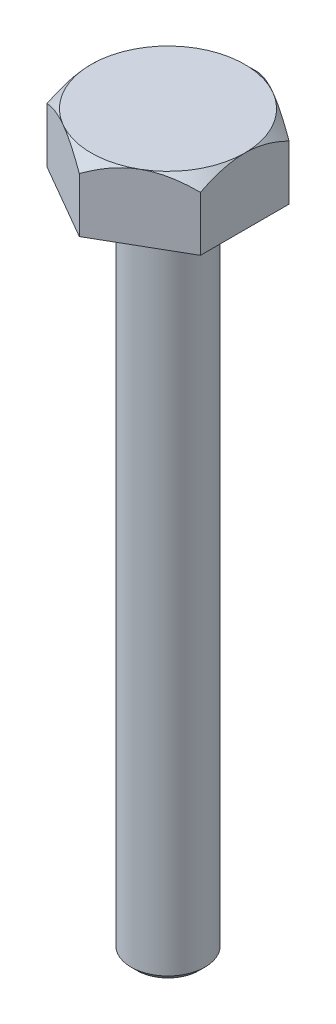
ISO-10303-21;
HEADER;
FILE_DESCRIPTION(('STEP AP214'),'2;1');
FILE_NAME('part.step','',(''),(''),'','','');
FILE_SCHEMA(('AUTOMOTIVE_DESIGN { 1 0 10303 214 1 1 1 1 }'));
ENDSEC;
DATA;
#1=APPLICATION_CONTEXT('core data for automotive mechanical design processes');
#2=APPLICATION_PROTOCOL_DEFINITION('international standard','automotive_design',2000,#1);
#3=PRODUCT_CONTEXT('',#1,'mechanical');
#4=PRODUCT('Part','Part','',(#3));
#5=PRODUCT_RELATED_PRODUCT_CATEGORY('part','',(#4));
#6=PRODUCT_DEFINITION_FORMATION('','',#4);
#7=PRODUCT_DEFINITION_CONTEXT('part definition',#1,'design');
#8=PRODUCT_DEFINITION('design','',#6,#7);
#9=PRODUCT_DEFINITION_SHAPE('','',#8);
#10=(LENGTH_UNIT() NAMED_UNIT(*) SI_UNIT(.MILLI.,.METRE.));
#11=(NAMED_UNIT(*) PLANE_ANGLE_UNIT() SI_UNIT($,.RADIAN.));
#12=(NAMED_UNIT(*) SI_UNIT($,.STERADIAN.) SOLID_ANGLE_UNIT());
#13=UNCERTAINTY_MEASURE_WITH_UNIT(LENGTH_MEASURE(1.E-05),#10,'distance_accuracy_value','');
#14=(GEOMETRIC_REPRESENTATION_CONTEXT(3) GLOBAL_UNCERTAINTY_ASSIGNED_CONTEXT((#13)) GLOBAL_UNIT_ASSIGNED_CONTEXT((#10,
#11,#12)) REPRESENTATION_CONTEXT('',''));
#15=CARTESIAN_POINT('',(0.,0.,0.));
#16=DIRECTION('',(0.,0.,1.));
#17=DIRECTION('',(1.,0.,0.));
#18=AXIS2_PLACEMENT_3D('',#15,#16,#17);
#19=CARTESIAN_POINT('',(0.,11.43,15.2512847109132));
#20=DIRECTION('',(-0.500000000000002,0.,-0.866025403784434));
#21=DIRECTION('',(-0.866025403784439,0.,0.499999999999996));
#22=AXIS2_PLACEMENT_3D('',#19,#20,#21);
#23=PLANE('',#22);
#24=CARTESIAN_POINT('',(-0.000199999999977996,9.38659981772166,15.251400180967));
#25=CARTESIAN_POINT('',(0.226873889695165,9.51768133076551,15.1202990096256));
#26=CARTESIAN_POINT('',(0.455726124637406,9.64476291818929,14.9881711101771));
#27=CARTESIAN_POINT('',(0.917264089385894,9.88965567416285,14.7217020419883));
#28=CARTESIAN_POINT('',(1.14995183005661,10.0074617799246,14.5873597122749));
#29=CARTESIAN_POINT('',(1.620535086189,10.2330319018744,14.3156683426708));
#30=CARTESIAN_POINT('',(1.85845279116084,10.3407345592772,14.1783064916603));
#31=CARTESIAN_POINT('',(2.33819586731142,10.5437586121221,13.9013266975029));
#32=CARTESIAN_POINT('',(2.58002063469585,10.639081900468,13.7617091029568));
#33=CARTESIAN_POINT('',(3.06368975918541,10.8143312174838,13.482462603734));
#34=CARTESIAN_POINT('',(3.30547468115945,10.8944747031529,13.3428680139463));
#35=CARTESIAN_POINT('',(3.79243386403268,11.0395670742934,13.0617219986301));
#36=CARTESIAN_POINT('',(4.03760775703844,11.1045175955454,12.9201707855049));
#37=CARTESIAN_POINT('',(4.53029621798643,11.2175888662254,12.63571696995));
#38=CARTESIAN_POINT('',(4.77780420672642,11.2657474965849,12.4928181660244));
#39=CARTESIAN_POINT('',(5.274898043017,11.3441767790177,12.2058209058295));
#40=CARTESIAN_POINT('',(5.52448357442961,11.3744501039869,12.0617226320825));
#41=CARTESIAN_POINT('',(6.13270550591775,11.4252101217525,11.7105655362108));
#42=CARTESIAN_POINT('',(6.49199931490381,11.4358618520917,11.5031271588746));
#43=CARTESIAN_POINT('',(7.20993709156137,11.4179816604071,11.08862559026));
#44=CARTESIAN_POINT('',(7.56858078733386,11.3894360036266,10.8815625559626));
#45=CARTESIAN_POINT('',(8.28248737985596,11.2948459617686,10.4693883925937));
#46=CARTESIAN_POINT('',(8.63774604391107,11.2287596468772,10.2642797072695));
#47=CARTESIAN_POINT('',(9.34215714214685,11.0626805202821,9.85758777008291));
#48=CARTESIAN_POINT('',(9.6913100424312,10.9626903087312,9.6560042491154));
#49=CARTESIAN_POINT('',(10.3110962937451,10.75698777407,9.29817049007927));
#50=CARTESIAN_POINT('',(10.5831024755108,10.6566870014691,9.1411276478156));
#51=CARTESIAN_POINT('',(11.1222324057565,10.4399235544401,8.82986083746005));
#52=CARTESIAN_POINT('',(11.3893560063565,10.3234603914122,8.67563695474674));
#53=CARTESIAN_POINT('',(11.9178793964651,10.0769825256759,8.37049383319454));
#54=CARTESIAN_POINT('',(12.1792942169843,9.9470104418666,8.21956591619763));
#55=CARTESIAN_POINT('',(12.6972836049224,9.67522082426369,7.92050460363419));
#56=CARTESIAN_POINT('',(12.9538610230554,9.53341055243061,7.77236956220708));
#57=CARTESIAN_POINT('',(13.2082,9.38659981772166,7.62552688540263));
#58=B_SPLINE_CURVE_WITH_KNOTS('',3,(#24,#25,#26,#27,#28,#29,#30,#31,#32,#33,#34,#35,#36,#37,#38,
#39,#40,#41,#42,#43,#44,#45,#46,#47,#48,#49,#50,#51,#52,#53,#54,#55,#56,#57),.UNSPECIFIED.,.F.,
.F.,(4,2,2,2,2,2,2,2,2,2,2,2,2,2,2,2,4),(0.,0.879464255051313,1.7594052628329,2.64438444686978,
3.5292281508387,4.40023568945079,5.27114940610042,6.14008551481257,7.00889173121453,
8.25199168167069,9.49552732527543,10.7404546341098,11.9852864887421,12.9739587551436,
13.9626609162771,14.9483334434941,15.9334057062132),.UNSPECIFIED.);
#59=CARTESIAN_POINT('',(0.,9.38671528908685,15.2512847109131));
#60=VERTEX_POINT('',#59);
#61=CARTESIAN_POINT('',(6.60400000000003,11.43,11.4384635331848));
#62=VERTEX_POINT('',#61);
#63=EDGE_CURVE('E186',#60,#62,#58,.T.);
#64=ORIENTED_EDGE('',*,*,#63,.F.);
#65=DIRECTION('',(0.,-0.999999999999995,0.));
#66=VECTOR('',#65,1.);
#67=CARTESIAN_POINT('',(0.,11.43,15.2512847109132));
#68=LINE('',#67,#66);
#69=CARTESIAN_POINT('',(0.,0.,15.2512847109132));
#70=VERTEX_POINT('',#69);
#71=EDGE_CURVE('E189',#60,#70,#68,.T.);
#72=ORIENTED_EDGE('',*,*,#71,.T.);
#73=DIRECTION('',(0.866025403784439,0.,-0.499999999999996));
#74=VECTOR('',#73,1.);
#75=CARTESIAN_POINT('',(0.,0.,15.2512847109132));
#76=LINE('',#75,#74);
#77=CARTESIAN_POINT('',(13.208,0.,7.6256423554566));
#78=VERTEX_POINT('',#77);
#79=EDGE_CURVE('E192',#70,#78,#76,.T.);
#80=ORIENTED_EDGE('',*,*,#79,.T.);
#81=DIRECTION('',(0.,-0.999999999999995,0.));
#82=VECTOR('',#81,1.);
#83=CARTESIAN_POINT('',(13.208,11.43,7.6256423554566));
#84=LINE('',#83,#82);
#85=CARTESIAN_POINT('',(13.208,9.38671528908685,7.6256423554566));
#86=VERTEX_POINT('',#85);
#87=EDGE_CURVE('E212',#86,#78,#84,.T.);
#88=ORIENTED_EDGE('',*,*,#87,.F.);
#89=EDGE_CURVE('E128',#62,#86,#58,.T.);
#90=ORIENTED_EDGE('',*,*,#89,.F.);
#91=EDGE_LOOP('',(#64,#72,#80,#88,#90));
#92=FACE_BOUND('',#91,.T.);
#93=ADVANCED_FACE('F53',(#92),#23,.F.);
#94=CARTESIAN_POINT('',(13.208,11.43,7.6256423554566));
#95=DIRECTION('',(-1.,0.,0.));
#96=DIRECTION('',(0.,0.,0.999999999999994));
#97=AXIS2_PLACEMENT_3D('',#94,#95,#96);
#98=PLANE('',#97);
#99=CARTESIAN_POINT('',(13.2080000000001,2.76967233523581,-17.429070280812));
#100=CARTESIAN_POINT('',(13.208,2.9353970235161,-17.2211314528595));
#101=CARTESIAN_POINT('',(13.208,3.10046346010986,-17.0126683334499));
#102=CARTESIAN_POINT('',(13.208,3.42914989687208,-16.594600449289));
#103=CARTESIAN_POINT('',(13.208,3.59276987696749,-16.3849956687595));
#104=CARTESIAN_POINT('',(13.208,4.0813224062418,-15.7542552195547));
#105=CARTESIAN_POINT('',(13.208,4.40388225777537,-15.3312751583127));
#106=CARTESIAN_POINT('',(13.208,5.04374780573923,-14.4763413305069));
#107=CARTESIAN_POINT('',(13.208,5.36099524275694,-14.0443438715202));
#108=CARTESIAN_POINT('',(13.208,5.98591190678579,-13.1735000637183));
#109=CARTESIAN_POINT('',(13.208,6.29358176929005,-12.7346541722248));
#110=CARTESIAN_POINT('',(13.208,6.92037320672384,-11.8146163167322));
#111=CARTESIAN_POINT('',(13.208,7.2385425352617,-11.3327725601302));
#112=CARTESIAN_POINT('',(13.208,7.85730475788191,-10.3577272750961));
#113=CARTESIAN_POINT('',(13.208,8.15789434448009,-9.86452363356868));
#114=CARTESIAN_POINT('',(13.208,8.73527228901875,-8.86627565247157));
#115=CARTESIAN_POINT('',(13.208,9.01212968907671,-8.36127150526345));
#116=CARTESIAN_POINT('',(13.208,9.53587440828102,-7.3360109441263));
#117=CARTESIAN_POINT('',(13.208,9.78277693834321,-6.81576243924099));
#118=CARTESIAN_POINT('',(13.208,10.1087397522399,-6.0573120283966));
#119=CARTESIAN_POINT('',(13.208,10.2037703363853,-5.8259487063906));
#120=CARTESIAN_POINT('',(13.208,10.3854713165141,-5.35998212042249));
#121=CARTESIAN_POINT('',(13.208,10.4721418936652,-5.12537892679686));
#122=CARTESIAN_POINT('',(13.208,10.7181863380057,-4.41656640225382));
#123=CARTESIAN_POINT('',(13.208,10.863611701905,-3.93731127460361));
#124=CARTESIAN_POINT('',(13.208,11.0462428459499,-3.21517741083885));
#125=CARTESIAN_POINT('',(13.208,11.1007849663038,-2.97659274330587));
#126=CARTESIAN_POINT('',(13.208,11.198080943139,-2.49704478186697));
#127=CARTESIAN_POINT('',(13.208,11.2408368877663,-2.2560819171499));
#128=CARTESIAN_POINT('',(13.208,11.3137704442067,-1.77228873749174));
#129=CARTESIAN_POINT('',(13.208,11.3439497966817,-1.52945868571975));
#130=CARTESIAN_POINT('',(13.208,11.3911362012472,-1.04251722126132));
#131=CARTESIAN_POINT('',(13.208,11.4081435620685,-0.798405838742286));
#132=CARTESIAN_POINT('',(13.208,11.4279880826698,-0.324899388387731));
#133=CARTESIAN_POINT('',(13.208,11.4316447102923,-0.0955384590511861));
#134=CARTESIAN_POINT('',(13.208,11.4270007132432,0.36305821272874));
#135=CARTESIAN_POINT('',(13.208,11.4187002948486,0.5922939572635));
#136=CARTESIAN_POINT('',(13.208,11.3902960558949,1.05002944978805));
#137=CARTESIAN_POINT('',(13.208,11.3701924019101,1.27852920811875));
#138=CARTESIAN_POINT('',(13.208,11.3185575189658,1.7342453917134));
#139=CARTESIAN_POINT('',(13.208,11.2870246224803,1.96146162479572));
#140=CARTESIAN_POINT('',(13.208,11.1746214023067,2.64916603023997));
#141=CARTESIAN_POINT('',(13.208,11.0765177927118,3.10691808382931));
#142=CARTESIAN_POINT('',(13.208,10.8410622083311,4.01193638688664));
#143=CARTESIAN_POINT('',(13.208,10.7037100097382,4.45920257654539));
#144=CARTESIAN_POINT('',(13.208,10.396494288822,5.34234869988729));
#145=CARTESIAN_POINT('',(13.208,10.2266271002391,5.77822734325166));
#146=CARTESIAN_POINT('',(13.208,9.86052168821442,6.63885682171184));
#147=CARTESIAN_POINT('',(13.208,9.66427212593931,7.06360277779132));
#148=CARTESIAN_POINT('',(13.208,9.25005326483396,7.90390303770095));
#149=CARTESIAN_POINT('',(13.208,9.03201917186019,8.31942514056893));
#150=CARTESIAN_POINT('',(13.208,8.57900114531303,9.14098385594647));
#151=CARTESIAN_POINT('',(13.208,8.34401971279601,9.5470218564407));
#152=CARTESIAN_POINT('',(13.208,7.87234617095731,10.330971193627));
#153=CARTESIAN_POINT('',(13.208,7.63631257225012,10.7092808372323));
#154=CARTESIAN_POINT('',(13.208,7.15410414783115,11.459399731739));
#155=CARTESIAN_POINT('',(13.208,6.90792857699179,11.8312085021544));
#156=CARTESIAN_POINT('',(13.208,6.40920790622932,12.5662260323197));
#157=CARTESIAN_POINT('',(13.208,6.15672850713001,12.9294795322765));
#158=CARTESIAN_POINT('',(13.208,5.64492806404401,13.6509899876102));
#159=CARTESIAN_POINT('',(13.208,5.38560892111492,14.0092482899173));
#160=CARTESIAN_POINT('',(13.208,5.12348725560632,14.3654078832139));
#161=B_SPLINE_CURVE_WITH_KNOTS('',3,(#99,#100,#101,#102,#103,#104,#105,#106,#107,#108,#109,#110,
#111,#112,#113,#114,#115,#116,#117,#118,#119,#120,#121,#122,#123,#124,#125,#126,#127,#128,#129,
#130,#131,#132,#133,#134,#135,#136,#137,#138,#139,#140,#141,#142,#143,#144,#145,#146,#147,#148,
#149,#150,#151,#152,#153,#154,#155,#156,#157,#158,#159,#160),.UNSPECIFIED.,.F.,.F.,(4,2,2,2,2,2,
2,2,2,2,2,2,2,2,2,2,2,2,2,2,2,2,2,2,2,2,2,2,2,2,4),(0.,0.797699900199711,1.59541085307429,
3.19114650853791,4.79896207154998,6.40667072408131,8.13861282556662,9.87087973637845,
11.5979227721281,13.3240851215051,14.074296886582,14.8244923903456,16.3247433531157,
17.0587283844279,17.7925832925867,18.5263365978717,19.2600727046128,19.9479341433099,
20.6357837154971,21.3236235805764,22.0115638418952,23.4137580889485,24.8159603318869,
26.2183207747508,27.6212858741094,29.0285556270311,30.4356181210347,31.7731399042402,
33.1107601306192,34.4378108460383,35.7644965252694),.UNSPECIFIED.);
#162=CARTESIAN_POINT('',(13.208,11.43,0.));
#163=VERTEX_POINT('',#162);
#164=EDGE_CURVE('E124',#86,#163,#161,.F.);
#165=ORIENTED_EDGE('',*,*,#164,.F.);
#166=ORIENTED_EDGE('',*,*,#87,.T.);
#167=DIRECTION('',(0.,0.,-0.999999999999994));
#168=VECTOR('',#167,1.);
#169=CARTESIAN_POINT('',(13.208,0.,7.6256423554566));
#170=LINE('',#169,#168);
#171=CARTESIAN_POINT('',(13.208,0.,-7.62564235545665));
#172=VERTEX_POINT('',#171);
#173=EDGE_CURVE('E268',#78,#172,#170,.T.);
#174=ORIENTED_EDGE('',*,*,#173,.T.);
#175=DIRECTION('',(0.,-0.999999999999995,0.));
#176=VECTOR('',#175,1.);
#177=CARTESIAN_POINT('',(13.208,11.43,-7.62564235545665));
#178=LINE('',#177,#176);
#179=CARTESIAN_POINT('',(13.208,9.38671528908685,-7.62564235545665));
#180=VERTEX_POINT('',#179);
#181=EDGE_CURVE('E153',#180,#172,#178,.T.);
#182=ORIENTED_EDGE('',*,*,#181,.F.);
#183=EDGE_CURVE('E132',#163,#180,#161,.F.);
#184=ORIENTED_EDGE('',*,*,#183,.F.);
#185=EDGE_LOOP('',(#165,#166,#174,#182,#184));
#186=FACE_BOUND('',#185,.T.);
#187=ADVANCED_FACE('F151',(#186),#98,.F.);
#188=CARTESIAN_POINT('',(13.208,11.43,-7.62564235545665));
#189=DIRECTION('',(-0.5,0.,0.866025403784433));
#190=DIRECTION('',(0.866025403784439,0.,0.5));
#191=AXIS2_PLACEMENT_3D('',#188,#189,#190);
#192=PLANE('',#191);
#193=CARTESIAN_POINT('',(13.2081999999999,9.38659981772166,-7.62552688540274));
#194=CARTESIAN_POINT('',(12.9811261103048,9.51768133076545,-7.75662805674423));
#195=CARTESIAN_POINT('',(12.7522738753626,9.6447629181892,-7.8887559561928));
#196=CARTESIAN_POINT('',(12.2907359106142,9.88965567416273,-8.15522502438158));
#197=CARTESIAN_POINT('',(12.0580481699435,10.0074617799245,-8.28956735409493));
#198=CARTESIAN_POINT('',(11.5874649138111,10.2330319018743,-8.56125872369908));
#199=CARTESIAN_POINT('',(11.3495472088392,10.3407345592771,-8.69862057470955));
#200=CARTESIAN_POINT('',(10.8698041326887,10.543758612122,-8.97560036886695));
#201=CARTESIAN_POINT('',(10.6279793653042,10.6390819004678,-9.11521796341307));
#202=CARTESIAN_POINT('',(10.1443102408147,10.8143312174837,-9.39446446263583));
#203=CARTESIAN_POINT('',(9.90252531884064,10.8944747031527,-9.53405905242353));
#204=CARTESIAN_POINT('',(9.41556613596741,11.0395670742932,-9.81520506773975));
#205=CARTESIAN_POINT('',(9.17039224296165,11.1045175955453,-9.95675628086488));
#206=CARTESIAN_POINT('',(8.67770378201369,11.2175888662252,-10.2412100964198));
#207=CARTESIAN_POINT('',(8.43019579327372,11.2657474965847,-10.3841089003455));
#208=CARTESIAN_POINT('',(7.93310195698311,11.3441767790176,-10.6711061605403));
#209=CARTESIAN_POINT('',(7.68351642557047,11.3744501039869,-10.8152044342871));
#210=CARTESIAN_POINT('',(7.07529449408231,11.4252101217525,-11.1663615301588));
#211=CARTESIAN_POINT('',(6.71600068509632,11.4358618520916,-11.3737999074951));
#212=CARTESIAN_POINT('',(5.99806290843879,11.4179816604069,-11.7883014761099));
#213=CARTESIAN_POINT('',(5.63941921266626,11.3894360036264,-11.9953645104073));
#214=CARTESIAN_POINT('',(4.92551262014413,11.2948459617684,-12.4075386737762));
#215=CARTESIAN_POINT('',(4.57025395608904,11.2287596468769,-12.6126473591003));
#216=CARTESIAN_POINT('',(3.86584285785319,11.0626805202819,-13.0193392962869));
#217=CARTESIAN_POINT('',(3.51668995756876,10.9626903087312,-13.2209228172544));
#218=CARTESIAN_POINT('',(2.89690370625486,10.75698777407,-13.5787565762905));
#219=CARTESIAN_POINT('',(2.62489752448925,10.656687001469,-13.7357994185542));
#220=CARTESIAN_POINT('',(2.08576759424359,10.4399235544399,-14.0470662289098));
#221=CARTESIAN_POINT('',(1.81864399364359,10.323460391412,-14.2012901116231));
#222=CARTESIAN_POINT('',(1.29012060353502,10.0769825256757,-14.5064332331753));
#223=CARTESIAN_POINT('',(1.02870578301584,9.94701044186642,-14.6573611501722));
#224=CARTESIAN_POINT('',(0.51071639507776,9.67522082426353,-14.9564224627356));
#225=CARTESIAN_POINT('',(0.254138976944705,9.5334105524305,-15.1045575041626));
#226=CARTESIAN_POINT('',(-0.000200000000005751,9.38659981772166,-15.251400180967));
#227=B_SPLINE_CURVE_WITH_KNOTS('',3,(#193,#194,#195,#196,#197,#198,#199,#200,#201,#202,#203,
#204,#205,#206,#207,#208,#209,#210,#211,#212,#213,#214,#215,#216,#217,#218,#219,#220,#221,#222,
#223,#224,#225,#226),.UNSPECIFIED.,.F.,.F.,(4,2,2,2,2,2,2,2,2,2,2,2,2,2,2,2,4),(0.,
0.87946425505127,1.75940526283282,2.6443844468697,3.5292281508386,4.40023568945069,
5.2711494061003,6.14008551481242,7.00889173121434,8.25199168167052,9.49552732527531,
10.7404546341097,11.9852864887421,12.9739587551435,13.9626609162769,14.948333443494,
15.9334057062131),.UNSPECIFIED.);
#228=CARTESIAN_POINT('',(6.604,11.43,-11.4384635331849));
#229=VERTEX_POINT('',#228);
#230=EDGE_CURVE('E139',#180,#229,#227,.T.);
#231=ORIENTED_EDGE('',*,*,#230,.F.);
#232=ORIENTED_EDGE('',*,*,#181,.T.);
#233=DIRECTION('',(-0.866025403784439,0.,-0.5));
#234=VECTOR('',#233,1.);
#235=CARTESIAN_POINT('',(13.208,0.,-7.62564235545665));
#236=LINE('',#235,#234);
#237=CARTESIAN_POINT('',(0.,0.,-15.2512847109131));
#238=VERTEX_POINT('',#237);
#239=EDGE_CURVE('E269',#172,#238,#236,.T.);
#240=ORIENTED_EDGE('',*,*,#239,.T.);
#241=DIRECTION('',(0.,-0.999999999999995,0.));
#242=VECTOR('',#241,1.);
#243=CARTESIAN_POINT('',(0.,11.43,-15.2512847109131));
#244=LINE('',#243,#242);
#245=CARTESIAN_POINT('',(0.,9.38671528908685,-15.2512847109131));
#246=VERTEX_POINT('',#245);
#247=EDGE_CURVE('E209',#246,#238,#244,.T.);
#248=ORIENTED_EDGE('',*,*,#247,.F.);
#249=EDGE_CURVE('E154',#229,#246,#227,.T.);
#250=ORIENTED_EDGE('',*,*,#249,.F.);
#251=EDGE_LOOP('',(#231,#232,#240,#248,#250));
#252=FACE_BOUND('',#251,.T.);
#253=ADVANCED_FACE('F177',(#252),#192,.F.);
#254=CARTESIAN_POINT('',(0.,11.43,-15.2512847109131));
#255=DIRECTION('',(0.500000000000002,0.,0.866025403784433));
#256=DIRECTION('',(0.866025403784438,0.,-0.499999999999996));
#257=AXIS2_PLACEMENT_3D('',#254,#255,#256);
#258=PLANE('',#257);
#259=CARTESIAN_POINT('',(0.00019999999995024,9.38659981772166,-15.251400180967));
#260=CARTESIAN_POINT('',(-0.226873889695179,9.51768133076548,-15.1202990096255));
#261=CARTESIAN_POINT('',(-0.455726124637413,9.64476291818924,-14.988171110177));
#262=CARTESIAN_POINT('',(-0.91726408938589,9.8896556741628,-14.7217020419882));
#263=CARTESIAN_POINT('',(-1.1499518300566,10.0074617799245,-14.5873597122749));
#264=CARTESIAN_POINT('',(-1.62053508618899,10.2330319018743,-14.3156683426707));
#265=CARTESIAN_POINT('',(-1.85845279116083,10.3407345592771,-14.1783064916602));
#266=CARTESIAN_POINT('',(-2.3381958673114,10.5437586121221,-13.9013266975028));
#267=CARTESIAN_POINT('',(-2.58002063469583,10.6390819004679,-13.7617091029567));
#268=CARTESIAN_POINT('',(-3.06368975918538,10.8143312174838,-13.4824626037339));
#269=CARTESIAN_POINT('',(-3.30547468115942,10.8944747031528,-13.3428680139462));
#270=CARTESIAN_POINT('',(-3.79243386403265,11.0395670742933,-13.06172199863));
#271=CARTESIAN_POINT('',(-4.03760775703841,11.1045175955454,-12.9201707855049));
#272=CARTESIAN_POINT('',(-4.53029621798639,11.2175888662253,-12.6357169699499));
#273=CARTESIAN_POINT('',(-4.77780420672637,11.2657474965849,-12.4928181660243));
#274=CARTESIAN_POINT('',(-5.27489804301698,11.3441767790177,-12.2058209058294));
#275=CARTESIAN_POINT('',(-5.52448357442963,11.3744501039869,-12.0617226320826));
#276=CARTESIAN_POINT('',(-6.13270550591779,11.4252101217525,-11.7105655362109));
#277=CARTESIAN_POINT('',(-6.49199931490378,11.4358618520917,-11.5031271588746));
#278=CARTESIAN_POINT('',(-7.2099370915613,11.4179816604071,-11.0886255902599));
#279=CARTESIAN_POINT('',(-7.56858078733382,11.3894360036266,-10.8815625559625));
#280=CARTESIAN_POINT('',(-8.28248737985592,11.2948459617685,-10.4693883925936));
#281=CARTESIAN_POINT('',(-8.63774604391102,11.2287596468772,-10.2642797072694));
#282=CARTESIAN_POINT('',(-9.34215714214682,11.0626805202821,-9.85758777008286));
#283=CARTESIAN_POINT('',(-9.6913100424312,10.9626903087312,-9.65600424911541));
#284=CARTESIAN_POINT('',(-10.3110962937451,10.75698777407,-9.29817049007927));
#285=CARTESIAN_POINT('',(-10.5831024755108,10.6566870014691,-9.14112764781556));
#286=CARTESIAN_POINT('',(-11.1222324057565,10.4399235544401,-8.82986083745998));
#287=CARTESIAN_POINT('',(-11.3893560063565,10.3234603914122,-8.67563695474669));
#288=CARTESIAN_POINT('',(-11.917879396465,10.0769825256759,-8.37049383319449));
#289=CARTESIAN_POINT('',(-12.1792942169842,9.9470104418666,-8.21956591619757));
#290=CARTESIAN_POINT('',(-12.6972836049223,9.67522082426369,-7.92050460363417));
#291=CARTESIAN_POINT('',(-12.9538610230553,9.53341055243061,-7.77236956220709));
#292=CARTESIAN_POINT('',(-13.2082,9.38659981772166,-7.62552688540274));
#293=B_SPLINE_CURVE_WITH_KNOTS('',3,(#259,#260,#261,#262,#263,#264,#265,#266,#267,#268,#269,
#270,#271,#272,#273,#274,#275,#276,#277,#278,#279,#280,#281,#282,#283,#284,#285,#286,#287,#288,
#289,#290,#291,#292),.UNSPECIFIED.,.F.,.F.,(4,2,2,2,2,2,2,2,2,2,2,2,2,2,2,2,4),(0.,
0.879464255051304,1.75940526283289,2.64438444686976,3.52922815083867,4.40023568945076,
5.27114940610039,6.14008551481253,7.00889173121449,8.25199168167065,9.49552732527539,
10.7404546341097,11.9852864887421,12.9739587551436,13.962660916277,14.948333443494,
15.9334057062131),.UNSPECIFIED.);
#294=CARTESIAN_POINT('',(-6.60400000000008,11.43,-11.4384635331848));
#295=VERTEX_POINT('',#294);
#296=EDGE_CURVE('E248',#246,#295,#293,.T.);
#297=ORIENTED_EDGE('',*,*,#296,.F.);
#298=ORIENTED_EDGE('',*,*,#247,.T.);
#299=DIRECTION('',(-0.866025403784439,0.,0.499999999999996));
#300=VECTOR('',#299,1.);
#301=CARTESIAN_POINT('',(0.,0.,-15.2512847109131));
#302=LINE('',#301,#300);
#303=CARTESIAN_POINT('',(-13.2080000000001,0.,-7.62564235545665));
#304=VERTEX_POINT('',#303);
#305=EDGE_CURVE('E265',#238,#304,#302,.T.);
#306=ORIENTED_EDGE('',*,*,#305,.T.);
#307=DIRECTION('',(0.,-0.999999999999995,0.));
#308=VECTOR('',#307,1.);
#309=CARTESIAN_POINT('',(-13.2080000000001,11.43,-7.62564235545665));
#310=LINE('',#309,#308);
#311=CARTESIAN_POINT('',(-13.2080000000001,9.38671528908685,-7.62564235545665));
#312=VERTEX_POINT('',#311);
#313=EDGE_CURVE('E202',#312,#304,#310,.T.);
#314=ORIENTED_EDGE('',*,*,#313,.F.);
#315=EDGE_CURVE('E244',#295,#312,#293,.T.);
#316=ORIENTED_EDGE('',*,*,#315,.F.);
#317=EDGE_LOOP('',(#297,#298,#306,#314,#316));
#318=FACE_BOUND('',#317,.T.);
#319=ADVANCED_FACE('F239',(#318),#258,.F.);
#320=CARTESIAN_POINT('',(-13.2080000000001,11.43,-7.62564235545665));
#321=DIRECTION('',(1.,0.,0.));
#322=DIRECTION('',(0.,0.,-0.999999999999994));
#323=AXIS2_PLACEMENT_3D('',#320,#321,#322);
#324=PLANE('',#323);
#325=CARTESIAN_POINT('',(-13.2080000000001,2.76967233523581,-17.4290702808122));
#326=CARTESIAN_POINT('',(-13.2080000000001,2.93539702351601,-17.2211314528596));
#327=CARTESIAN_POINT('',(-13.2080000000001,3.10046346010973,-17.0126683334499));
#328=CARTESIAN_POINT('',(-13.2080000000001,3.42914989687192,-16.5946004492891));
#329=CARTESIAN_POINT('',(-13.2080000000001,3.59276987696734,-16.3849956687596));
#330=CARTESIAN_POINT('',(-13.2080000000001,4.08132240624166,-15.7542552195548));
#331=CARTESIAN_POINT('',(-13.2080000000001,4.40388225777522,-15.3312751583128));
#332=CARTESIAN_POINT('',(-13.2080000000001,5.04374780573907,-14.476341330507));
#333=CARTESIAN_POINT('',(-13.2080000000001,5.36099524275679,-14.0443438715203));
#334=CARTESIAN_POINT('',(-13.2080000000001,5.98591190678564,-13.1735000637183));
#335=CARTESIAN_POINT('',(-13.2080000000001,6.29358176928991,-12.7346541722248));
#336=CARTESIAN_POINT('',(-13.2080000000001,6.9203732067237,-11.8146163167322));
#337=CARTESIAN_POINT('',(-13.2080000000001,7.23854253526156,-11.3327725601302));
#338=CARTESIAN_POINT('',(-13.2080000000001,7.85730475788178,-10.3577272750962));
#339=CARTESIAN_POINT('',(-13.2080000000001,8.15789434447997,-9.86452363356874));
#340=CARTESIAN_POINT('',(-13.2080000000001,8.7352722890186,-8.86627565247161));
#341=CARTESIAN_POINT('',(-13.2080000000001,9.0121296890765,-8.36127150526348));
#342=CARTESIAN_POINT('',(-13.2080000000001,9.53587440828094,-7.3360109441264));
#343=CARTESIAN_POINT('',(-13.2080000000001,9.7827769383433,-6.81576243924118));
#344=CARTESIAN_POINT('',(-13.2080000000001,10.1087397522398,-6.05731202839675));
#345=CARTESIAN_POINT('',(-13.2080000000001,10.2037703363851,-5.82594870639072));
#346=CARTESIAN_POINT('',(-13.2080000000001,10.3854713165139,-5.35998212042256));
#347=CARTESIAN_POINT('',(-13.2080000000001,10.4721418936651,-5.12537892679694));
#348=CARTESIAN_POINT('',(-13.2080000000001,10.7181863380056,-4.41656640225391));
#349=CARTESIAN_POINT('',(-13.2080000000001,10.8636117019049,-3.93731127460368));
#350=CARTESIAN_POINT('',(-13.2080000000001,11.0462428459497,-3.21517741083889));
#351=CARTESIAN_POINT('',(-13.2080000000001,11.1007849663036,-2.9765927433059));
#352=CARTESIAN_POINT('',(-13.2080000000001,11.1980809431389,-2.49704478186699));
#353=CARTESIAN_POINT('',(-13.2080000000001,11.2408368877662,-2.25608191714991));
#354=CARTESIAN_POINT('',(-13.2080000000001,11.3137704442065,-1.77228873749174));
#355=CARTESIAN_POINT('',(-13.2080000000001,11.3439497966815,-1.52945868571975));
#356=CARTESIAN_POINT('',(-13.2080000000001,11.3911362012471,-1.04251722126132));
#357=CARTESIAN_POINT('',(-13.208,11.4081435620685,-0.798405838742286));
#358=CARTESIAN_POINT('',(-13.208,11.4279880826697,-0.324899388387739));
#359=CARTESIAN_POINT('',(-13.2080000000001,11.4316447102922,-0.0955384590511993));
#360=CARTESIAN_POINT('',(-13.2080000000001,11.427000713243,0.363058212728716));
#361=CARTESIAN_POINT('',(-13.2080000000001,11.4187002948485,0.59229395726347));
#362=CARTESIAN_POINT('',(-13.2080000000001,11.3902960558948,1.05002944978801));
#363=CARTESIAN_POINT('',(-13.2080000000001,11.37019240191,1.27852920811871));
#364=CARTESIAN_POINT('',(-13.2080000000001,11.3185575189657,1.73424539171335));
#365=CARTESIAN_POINT('',(-13.2080000000001,11.2870246224801,1.96146162479567));
#366=CARTESIAN_POINT('',(-13.2080000000001,11.1746214023066,2.64916603023992));
#367=CARTESIAN_POINT('',(-13.2080000000001,11.0765177927117,3.10691808382925));
#368=CARTESIAN_POINT('',(-13.2080000000001,10.841062208331,4.01193638688658));
#369=CARTESIAN_POINT('',(-13.208,10.7037100097382,4.45920257654534));
#370=CARTESIAN_POINT('',(-13.208,10.396494288822,5.34234869988723));
#371=CARTESIAN_POINT('',(-13.2080000000001,10.226627100239,5.77822734325157));
#372=CARTESIAN_POINT('',(-13.2080000000001,9.86052168821433,6.63885682171172));
#373=CARTESIAN_POINT('',(-13.2080000000001,9.66427212593924,7.06360277779121));
#374=CARTESIAN_POINT('',(-13.2080000000001,9.2500532648339,7.90390303770084));
#375=CARTESIAN_POINT('',(-13.2080000000001,9.03201917186014,8.31942514056882));
#376=CARTESIAN_POINT('',(-13.2080000000001,8.57900114531297,9.14098385594637));
#377=CARTESIAN_POINT('',(-13.2080000000001,8.34401971279596,9.5470218564406));
#378=CARTESIAN_POINT('',(-13.2080000000001,7.87234617095726,10.3309711936269));
#379=CARTESIAN_POINT('',(-13.2080000000001,7.63631257225007,10.7092808372322));
#380=CARTESIAN_POINT('',(-13.2080000000001,7.1541041478311,11.4593997317389));
#381=CARTESIAN_POINT('',(-13.2080000000001,6.90792857699174,11.8312085021543));
#382=CARTESIAN_POINT('',(-13.2080000000001,6.40920790622927,12.5662260323196));
#383=CARTESIAN_POINT('',(-13.2080000000001,6.15672850712996,12.9294795322764));
#384=CARTESIAN_POINT('',(-13.2080000000001,5.64492806404397,13.6509899876101));
#385=CARTESIAN_POINT('',(-13.2080000000001,5.38560892111489,14.0092482899172));
#386=CARTESIAN_POINT('',(-13.208,5.12348725560632,14.3654078832139));
#387=B_SPLINE_CURVE_WITH_KNOTS('',3,(#325,#326,#327,#328,#329,#330,#331,#332,#333,#334,#335,
#336,#337,#338,#339,#340,#341,#342,#343,#344,#345,#346,#347,#348,#349,#350,#351,#352,#353,#354,
#355,#356,#357,#358,#359,#360,#361,#362,#363,#364,#365,#366,#367,#368,#369,#370,#371,#372,#373,
#374,#375,#376,#377,#378,#379,#380,#381,#382,#383,#384,#385,#386),.UNSPECIFIED.,.F.,.F.,(4,2,2,
2,2,2,2,2,2,2,2,2,2,2,2,2,2,2,2,2,2,2,2,2,2,2,2,2,2,2,4),(0.,0.797699900199698,1.59541085307427,
3.19114650853787,4.79896207154997,6.40667072408131,8.13861282556662,9.87087973637846,
11.5979227721281,13.3240851215051,14.074296886582,14.8244923903456,16.3247433531157,
17.0587283844279,17.7925832925868,18.5263365978717,19.2600727046129,19.9479341433099,
20.6357837154972,21.3236235805764,22.0115638418952,23.4137580889485,24.8159603318868,
26.2183207747507,27.6212858741093,29.0285556270311,30.4356181210347,31.7731399042401,
33.1107601306191,34.4378108460383,35.7644965252694),.UNSPECIFIED.);
#388=CARTESIAN_POINT('',(-13.2080000000001,11.43,-1.66533453693773E-13));
#389=VERTEX_POINT('',#388);
#390=EDGE_CURVE('E249',#312,#389,#387,.T.);
#391=ORIENTED_EDGE('',*,*,#390,.F.);
#392=ORIENTED_EDGE('',*,*,#313,.T.);
#393=DIRECTION('',(0.,0.,0.999999999999994));
#394=VECTOR('',#393,1.);
#395=CARTESIAN_POINT('',(-13.2080000000001,0.,-7.62564235545665));
#396=LINE('',#395,#394);
#397=CARTESIAN_POINT('',(-13.208,0.,7.6256423554566));
#398=VERTEX_POINT('',#397);
#399=EDGE_CURVE('E204',#304,#398,#396,.T.);
#400=ORIENTED_EDGE('',*,*,#399,.T.);
#401=DIRECTION('',(0.,-0.999999999999995,0.));
#402=VECTOR('',#401,1.);
#403=CARTESIAN_POINT('',(-13.208,11.43,7.6256423554566));
#404=LINE('',#403,#402);
#405=CARTESIAN_POINT('',(-13.208,9.38671528908685,7.6256423554566));
#406=VERTEX_POINT('',#405);
#407=EDGE_CURVE('E200',#406,#398,#404,.T.);
#408=ORIENTED_EDGE('',*,*,#407,.F.);
#409=EDGE_CURVE('E227',#389,#406,#387,.T.);
#410=ORIENTED_EDGE('',*,*,#409,.F.);
#411=EDGE_LOOP('',(#391,#392,#400,#408,#410));
#412=FACE_BOUND('',#411,.T.);
#413=ADVANCED_FACE('F236',(#412),#324,.F.);
#414=CARTESIAN_POINT('',(-13.208,11.43,7.6256423554566));
#415=DIRECTION('',(0.5,0.,-0.866025403784433));
#416=DIRECTION('',(-0.866025403784439,0.,-0.5));
#417=AXIS2_PLACEMENT_3D('',#414,#415,#416);
#418=PLANE('',#417);
#419=CARTESIAN_POINT('',(-13.2082,9.38659981772166,7.62552688540274));
#420=CARTESIAN_POINT('',(-12.9811261103049,9.51768133076551,7.75662805674417));
#421=CARTESIAN_POINT('',(-12.7522738753626,9.64476291818928,7.88875595619272));
#422=CARTESIAN_POINT('',(-12.2907359106142,9.88965567416284,8.15522502438149));
#423=CARTESIAN_POINT('',(-12.0580481699434,10.0074617799246,8.28956735409485));
#424=CARTESIAN_POINT('',(-11.5874649138111,10.2330319018744,8.56125872369902));
#425=CARTESIAN_POINT('',(-11.3495472088392,10.3407345592772,8.69862057470949));
#426=CARTESIAN_POINT('',(-10.8698041326886,10.5437586121221,8.97560036886689));
#427=CARTESIAN_POINT('',(-10.6279793653042,10.639081900468,9.11521796341301));
#428=CARTESIAN_POINT('',(-10.1443102408146,10.8143312174838,9.39446446263577));
#429=CARTESIAN_POINT('',(-9.9025253188406,10.8944747031529,9.53405905242347));
#430=CARTESIAN_POINT('',(-9.41556613596737,11.0395670742933,9.8152050677397));
#431=CARTESIAN_POINT('',(-9.17039224296161,11.1045175955454,9.95675628086485));
#432=CARTESIAN_POINT('',(-8.67770378201362,11.2175888662254,10.2412100964198));
#433=CARTESIAN_POINT('',(-8.43019579327362,11.2657474965849,10.3841089003454));
#434=CARTESIAN_POINT('',(-7.93310195698305,11.3441767790177,10.6711061605403));
#435=CARTESIAN_POINT('',(-7.68351642557047,11.3744501039869,10.8152044342873));
#436=CARTESIAN_POINT('',(-7.07529449408234,11.4252101217525,11.166361530159));
#437=CARTESIAN_POINT('',(-6.71600068509625,11.4358618520917,11.3737999074952));
#438=CARTESIAN_POINT('',(-5.99806290843866,11.4179816604071,11.7883014761098));
#439=CARTESIAN_POINT('',(-5.63941921266617,11.3894360036266,11.9953645104072));
#440=CARTESIAN_POINT('',(-4.92551262014409,11.2948459617685,12.4075386737761));
#441=CARTESIAN_POINT('',(-4.57025395608899,11.2287596468771,12.6126473591003));
#442=CARTESIAN_POINT('',(-3.86584285785317,11.0626805202821,13.0193392962868));
#443=CARTESIAN_POINT('',(-3.51668995756876,10.9626903087312,13.2209228172543));
#444=CARTESIAN_POINT('',(-2.89690370625485,10.75698777407,13.5787565762904));
#445=CARTESIAN_POINT('',(-2.62489752448921,10.6566870014691,13.7357994185541));
#446=CARTESIAN_POINT('',(-2.08576759424353,10.4399235544401,14.0470662289097));
#447=CARTESIAN_POINT('',(-1.81864399364353,10.3234603914122,14.201290111623));
#448=CARTESIAN_POINT('',(-1.29012060353496,10.0769825256759,14.5064332331752));
#449=CARTESIAN_POINT('',(-1.02870578301577,9.9470104418666,14.6573611501721));
#450=CARTESIAN_POINT('',(-0.510716395077697,9.6752208242637,14.9564224627355));
#451=CARTESIAN_POINT('',(-0.254138976944665,9.53341055243062,15.1045575041626));
#452=CARTESIAN_POINT('',(0.000199999999977996,9.38659981772166,15.251400180967));
#453=B_SPLINE_CURVE_WITH_KNOTS('',3,(#419,#420,#421,#422,#423,#424,#425,#426,#427,#428,#429,
#430,#431,#432,#433,#434,#435,#436,#437,#438,#439,#440,#441,#442,#443,#444,#445,#446,#447,#448,
#449,#450,#451,#452),.UNSPECIFIED.,.F.,.F.,(4,2,2,2,2,2,2,2,2,2,2,2,2,2,2,2,4),(0.,
0.879464255051311,1.7594052628329,2.64438444686978,3.5292281508387,4.40023568945079,
5.27114940610042,6.14008551481257,7.00889173121454,8.25199168167069,9.49552732527544,
10.7404546341098,11.9852864887422,12.9739587551436,13.962660916277,14.9483334434941,
15.9334057062132),.UNSPECIFIED.);
#454=CARTESIAN_POINT('',(-6.604,11.43,11.4384635331848));
#455=VERTEX_POINT('',#454);
#456=EDGE_CURVE('E226',#406,#455,#453,.T.);
#457=ORIENTED_EDGE('',*,*,#456,.F.);
#458=ORIENTED_EDGE('',*,*,#407,.T.);
#459=DIRECTION('',(0.866025403784439,0.,0.5));
#460=VECTOR('',#459,1.);
#461=CARTESIAN_POINT('',(-13.208,0.,7.6256423554566));
#462=LINE('',#461,#460);
#463=EDGE_CURVE('E198',#398,#70,#462,.T.);
#464=ORIENTED_EDGE('',*,*,#463,.T.);
#465=ORIENTED_EDGE('',*,*,#71,.F.);
#466=EDGE_CURVE('E148',#455,#60,#453,.T.);
#467=ORIENTED_EDGE('',*,*,#466,.F.);
#468=EDGE_LOOP('',(#457,#458,#464,#465,#467));
#469=FACE_BOUND('',#468,.T.);
#470=ADVANCED_FACE('F196',(#469),#418,.F.);
#471=CARTESIAN_POINT('',(0.,0.,0.));
#472=DIRECTION('',(0.,0.999999999999995,0.));
#473=DIRECTION('',(0.,0.,0.999999999999994));
#474=AXIS2_PLACEMENT_3D('',#471,#472,#473);
#475=PLANE('',#474);
#476=CARTESIAN_POINT('',(0.,0.,0.));
#477=DIRECTION('',(0.,-0.999999999999995,0.));
#478=DIRECTION('',(0.,0.,-0.999999999999994));
#479=AXIS2_PLACEMENT_3D('',#476,#477,#478);
#480=CIRCLE('',#479,6.35);
#481=CARTESIAN_POINT('',(0.,0.,6.34999999999952));
#482=VERTEX_POINT('',#481);
#483=EDGE_CURVE('E143',#482,#482,#480,.T.);
#484=ORIENTED_EDGE('',*,*,#483,.F.);
#485=EDGE_LOOP('',(#484));
#486=FACE_BOUND('',#485,.T.);
#487=ORIENTED_EDGE('',*,*,#79,.F.);
#488=ORIENTED_EDGE('',*,*,#463,.F.);
#489=ORIENTED_EDGE('',*,*,#399,.F.);
#490=ORIENTED_EDGE('',*,*,#305,.F.);
#491=ORIENTED_EDGE('',*,*,#239,.F.);
#492=ORIENTED_EDGE('',*,*,#173,.F.);
#493=EDGE_LOOP('',(#487,#488,#489,#490,#491,#492));
#494=FACE_BOUND('',#493,.T.);
#495=ADVANCED_FACE('F235',(#486,#494),#475,.F.);
#496=CARTESIAN_POINT('',(0.,11.43,0.));
#497=DIRECTION('',(0.,-0.999999999999995,0.));
#498=DIRECTION('',(0.,0.,0.999999999999994));
#499=AXIS2_PLACEMENT_3D('',#496,#497,#498);
#500=CONICAL_SURFACE('',#499,13.208,0.78539816339745);
#501=ORIENTED_EDGE('',*,*,#63,.T.);
#502=CARTESIAN_POINT('',(0.,11.43,0.));
#503=DIRECTION('',(0.,0.999999999999995,0.));
#504=DIRECTION('',(0.,0.,0.999999999999994));
#505=AXIS2_PLACEMENT_3D('',#502,#503,#504);
#506=CIRCLE('',#505,13.208);
#507=EDGE_CURVE('E146',#455,#62,#506,.T.);
#508=ORIENTED_EDGE('',*,*,#507,.F.);
#509=ORIENTED_EDGE('',*,*,#466,.T.);
#510=EDGE_LOOP('',(#501,#508,#509));
#511=FACE_BOUND('',#510,.T.);
#512=ADVANCED_FACE('F171',(#511),#500,.T.);
#513=ORIENTED_EDGE('',*,*,#409,.T.);
#514=ORIENTED_EDGE('',*,*,#456,.T.);
#515=EDGE_CURVE('E76',#389,#455,#506,.T.);
#516=ORIENTED_EDGE('',*,*,#515,.F.);
#517=EDGE_LOOP('',(#513,#514,#516));
#518=FACE_BOUND('',#517,.T.);
#519=ADVANCED_FACE('F257',(#518),#500,.T.);
#520=ORIENTED_EDGE('',*,*,#315,.T.);
#521=ORIENTED_EDGE('',*,*,#390,.T.);
#522=EDGE_CURVE('E279',#295,#389,#506,.T.);
#523=ORIENTED_EDGE('',*,*,#522,.F.);
#524=EDGE_LOOP('',(#520,#521,#523));
#525=FACE_BOUND('',#524,.T.);
#526=ADVANCED_FACE('F280',(#525),#500,.T.);
#527=ORIENTED_EDGE('',*,*,#249,.T.);
#528=ORIENTED_EDGE('',*,*,#296,.T.);
#529=EDGE_CURVE('E144',#229,#295,#506,.T.);
#530=ORIENTED_EDGE('',*,*,#529,.F.);
#531=EDGE_LOOP('',(#527,#528,#530));
#532=FACE_BOUND('',#531,.T.);
#533=ADVANCED_FACE('F278',(#532),#500,.T.);
#534=ORIENTED_EDGE('',*,*,#183,.T.);
#535=ORIENTED_EDGE('',*,*,#230,.T.);
#536=EDGE_CURVE('E136',#163,#229,#506,.T.);
#537=ORIENTED_EDGE('',*,*,#536,.F.);
#538=EDGE_LOOP('',(#534,#535,#537));
#539=FACE_BOUND('',#538,.T.);
#540=ADVANCED_FACE('F137',(#539),#500,.T.);
#541=ORIENTED_EDGE('',*,*,#89,.T.);
#542=ORIENTED_EDGE('',*,*,#164,.T.);
#543=CARTESIAN_POINT('',(0.,11.43,0.));
#544=DIRECTION('',(0.,0.999999999999995,0.));
#545=DIRECTION('',(0.,0.,0.999999999999994));
#546=AXIS2_PLACEMENT_3D('',#543,#544,#545);
#547=CIRCLE('',#546,13.208);
#548=EDGE_CURVE('E68',#62,#163,#547,.T.);
#549=ORIENTED_EDGE('',*,*,#548,.F.);
#550=EDGE_LOOP('',(#541,#542,#549));
#551=FACE_BOUND('',#550,.T.);
#552=ADVANCED_FACE('F126',(#551),#500,.T.);
#553=CARTESIAN_POINT('',(0.,11.43,0.));
#554=DIRECTION('',(0.,0.999999999999995,0.));
#555=DIRECTION('',(0.,0.,0.999999999999994));
#556=AXIS2_PLACEMENT_3D('',#553,#554,#555);
#557=PLANE('',#556);
#558=ORIENTED_EDGE('',*,*,#507,.T.);
#559=ORIENTED_EDGE('',*,*,#548,.T.);
#560=ORIENTED_EDGE('',*,*,#536,.T.);
#561=ORIENTED_EDGE('',*,*,#529,.T.);
#562=ORIENTED_EDGE('',*,*,#522,.T.);
#563=ORIENTED_EDGE('',*,*,#515,.T.);
#564=EDGE_LOOP('',(#558,#559,#560,#561,#562,#563));
#565=FACE_BOUND('',#564,.T.);
#566=ADVANCED_FACE('F147',(#565),#557,.T.);
#567=CARTESIAN_POINT('',(0.,-114.3,0.));
#568=DIRECTION('',(0.,0.999999999999995,0.));
#569=DIRECTION('',(0.,0.,0.999999999999994));
#570=AXIS2_PLACEMENT_3D('',#567,#568,#569);
#571=CYLINDRICAL_SURFACE('',#570,6.35);
#572=CARTESIAN_POINT('',(0.,-113.284,0.));
#573=DIRECTION('',(0.,-0.999999999999995,0.));
#574=DIRECTION('',(0.,0.,-0.999999999999994));
#575=AXIS2_PLACEMENT_3D('',#572,#573,#574);
#576=CIRCLE('',#575,6.35);
#577=CARTESIAN_POINT('',(0.,-113.284,6.34999999999996));
#578=VERTEX_POINT('',#577);
#579=EDGE_CURVE('E14',#578,#578,#576,.F.);
#580=CARTESIAN_POINT('',(0.,-113.284,6.34999999999996));
#581=CARTESIAN_POINT('',(0.,-112.103958333333,6.34999999999995));
#582=CARTESIAN_POINT('',(0.,-110.923916666666,6.34999999999995));
#583=CARTESIAN_POINT('',(0.,-108.563833333333,6.34999999999994));
#584=CARTESIAN_POINT('',(0.,-107.383791666666,6.34999999999993));
#585=CARTESIAN_POINT('',(0.,-105.023708333333,6.34999999999992));
#586=CARTESIAN_POINT('',(0.,-103.843666666666,6.34999999999992));
#587=CARTESIAN_POINT('',(0.,-101.483583333333,6.34999999999991));
#588=CARTESIAN_POINT('',(0.,-100.303541666666,6.34999999999991));
#589=CARTESIAN_POINT('',(0.,-97.9434583333331,6.3499999999999));
#590=CARTESIAN_POINT('',(0.,-96.7634166666664,6.34999999999989));
#591=CARTESIAN_POINT('',(0.,-94.4033333333331,6.34999999999988));
#592=CARTESIAN_POINT('',(0.,-93.2232916666664,6.34999999999988));
#593=CARTESIAN_POINT('',(0.,-90.8632083333331,6.34999999999987));
#594=CARTESIAN_POINT('',(0.,-89.6831666666664,6.34999999999987));
#595=CARTESIAN_POINT('',(0.,-87.3230833333331,6.34999999999986));
#596=CARTESIAN_POINT('',(0.,-86.1430416666664,6.34999999999985));
#597=CARTESIAN_POINT('',(0.,-83.7829583333331,6.34999999999984));
#598=CARTESIAN_POINT('',(0.,-82.6029166666664,6.34999999999984));
#599=CARTESIAN_POINT('',(0.,-80.2428333333331,6.34999999999983));
#600=CARTESIAN_POINT('',(0.,-79.0627916666664,6.34999999999982));
#601=CARTESIAN_POINT('',(0.,-76.7027083333331,6.34999999999982));
#602=CARTESIAN_POINT('',(0.,-75.5226666666665,6.34999999999981));
#603=CARTESIAN_POINT('',(0.,-73.1625833333331,6.3499999999998));
#604=CARTESIAN_POINT('',(0.,-71.9825416666664,6.3499999999998));
#605=CARTESIAN_POINT('',(0.,-69.6224583333331,6.34999999999979));
#606=CARTESIAN_POINT('',(0.,-68.4424166666665,6.34999999999978));
#607=CARTESIAN_POINT('',(0.,-66.0823333333331,6.34999999999978));
#608=CARTESIAN_POINT('',(0.,-64.9022916666665,6.34999999999977));
#609=CARTESIAN_POINT('',(0.,-62.5422083333332,6.34999999999976));
#610=CARTESIAN_POINT('',(0.,-61.3621666666665,6.34999999999976));
#611=CARTESIAN_POINT('',(0.,-59.0020833333332,6.34999999999975));
#612=CARTESIAN_POINT('',(0.,-57.8220416666665,6.34999999999974));
#613=CARTESIAN_POINT('',(0.,-55.4619583333332,6.34999999999973));
#614=CARTESIAN_POINT('',(0.,-54.2819166666665,6.34999999999973));
#615=CARTESIAN_POINT('',(0.,-51.9218333333332,6.34999999999972));
#616=CARTESIAN_POINT('',(0.,-50.7417916666665,6.34999999999972));
#617=CARTESIAN_POINT('',(0.,-48.3817083333332,6.34999999999971));
#618=CARTESIAN_POINT('',(0.,-47.2016666666665,6.3499999999997));
#619=CARTESIAN_POINT('',(0.,-44.8415833333332,6.34999999999969));
#620=CARTESIAN_POINT('',(0.,-43.6615416666665,6.34999999999969));
#621=CARTESIAN_POINT('',(0.,-41.3014583333332,6.34999999999968));
#622=CARTESIAN_POINT('',(0.,-40.1214166666665,6.34999999999968));
#623=CARTESIAN_POINT('',(0.,-37.7613333333332,6.34999999999967));
#624=CARTESIAN_POINT('',(0.,-36.5812916666666,6.34999999999966));
#625=CARTESIAN_POINT('',(0.,-34.2212083333332,6.34999999999965));
#626=CARTESIAN_POINT('',(0.,-33.0411666666666,6.34999999999965));
#627=CARTESIAN_POINT('',(0.,-30.6810833333332,6.34999999999964));
#628=CARTESIAN_POINT('',(0.,-29.5010416666666,6.34999999999964));
#629=CARTESIAN_POINT('',(0.,-27.1409583333332,6.34999999999963));
#630=CARTESIAN_POINT('',(0.,-25.9609166666666,6.34999999999962));
#631=CARTESIAN_POINT('',(0.,-23.6008333333333,6.34999999999962));
#632=CARTESIAN_POINT('',(0.,-22.4207916666666,6.34999999999961));
#633=CARTESIAN_POINT('',(0.,-20.0607083333333,6.3499999999996));
#634=CARTESIAN_POINT('',(0.,-18.8806666666666,6.3499999999996));
#635=CARTESIAN_POINT('',(0.,-16.5205833333333,6.34999999999959));
#636=CARTESIAN_POINT('',(0.,-15.3405416666666,6.34999999999958));
#637=CARTESIAN_POINT('',(0.,-12.9804583333333,6.34999999999957));
#638=CARTESIAN_POINT('',(0.,-11.8004166666666,6.34999999999957));
#639=CARTESIAN_POINT('',(0.,-9.44033333333329,6.34999999999956));
#640=CARTESIAN_POINT('',(0.,-8.26029166666663,6.34999999999956));
#641=CARTESIAN_POINT('',(0.,-5.9002083333333,6.34999999999955));
#642=CARTESIAN_POINT('',(0.,-4.72016666666664,6.34999999999954));
#643=CARTESIAN_POINT('',(0.,-2.36008333333331,6.34999999999953));
#644=CARTESIAN_POINT('',(0.,-1.18004166666665,6.34999999999953));
#645=CARTESIAN_POINT('',(0.,0.,6.34999999999952));
#646=B_SPLINE_CURVE_WITH_KNOTS('',3,(#580,#581,#582,#583,#584,#585,#586,#587,#588,#589,#590,
#591,#592,#593,#594,#595,#596,#597,#598,#599,#600,#601,#602,#603,#604,#605,#606,#607,#608,#609,
#610,#611,#612,#613,#614,#615,#616,#617,#618,#619,#620,#621,#622,#623,#624,#625,#626,#627,#628,
#629,#630,#631,#632,#633,#634,#635,#636,#637,#638,#639,#640,#641,#642,#643,#644,#645),
.UNSPECIFIED.,.F.,.F.,(4,2,2,2,2,2,2,2,2,2,2,2,2,2,2,2,2,2,2,2,2,2,2,2,2,2,2,2,2,2,2,2,4),(0.,
3.54012499999999,7.08024999999998,10.620375,14.1605,17.700625,21.2407499999999,24.7808749999999,
28.3209999999999,31.8611249999999,35.4012499999999,38.9413749999999,42.4814999999999,
46.0216249999999,49.5617499999999,53.1018749999999,56.6419999999998,60.1821249999998,
63.7222499999998,67.2623749999998,70.8024999999998,74.3426249999998,77.8827499999998,
81.4228749999998,84.9629999999998,88.5031249999998,92.0432499999997,95.5833749999997,
99.1234999999997,102.663625,106.20375,109.743875,113.284),.UNSPECIFIED.);
#647=EDGE_CURVE('BSEAM298',#578,#482,#646,.T.);
#648=ORIENTED_EDGE('',*,*,#579,.T.);
#649=ORIENTED_EDGE('',*,*,#483,.T.);
#650=ORIENTED_EDGE('',*,*,#647,.T.);
#651=ORIENTED_EDGE('',*,*,#647,.F.);
#652=EDGE_LOOP('',(#648,#650,#649,#651));
#653=FACE_BOUND('',#652,.T.);
#654=ADVANCED_FACE('F298',(#653),#571,.T.);
#655=CARTESIAN_POINT('',(0.,-114.3,0.));
#656=DIRECTION('',(0.,-0.999999999999995,0.));
#657=DIRECTION('',(0.,0.,-0.999999999999994));
#658=AXIS2_PLACEMENT_3D('',#655,#656,#657);
#659=PLANE('',#658);
#660=CARTESIAN_POINT('',(0.,-114.3,0.));
#661=DIRECTION('',(0.,-0.999999999999995,0.));
#662=DIRECTION('',(0.,0.,-0.999999999999994));
#663=AXIS2_PLACEMENT_3D('',#660,#661,#662);
#664=CIRCLE('',#663,5.33399999999999);
#665=CARTESIAN_POINT('',(0.,-114.3,5.33399999999999));
#666=VERTEX_POINT('',#665);
#667=EDGE_CURVE('E61',#666,#666,#664,.T.);
#668=ORIENTED_EDGE('',*,*,#667,.T.);
#669=EDGE_LOOP('',(#668));
#670=FACE_BOUND('',#669,.T.);
#671=ADVANCED_FACE('F348',(#670),#659,.T.);
#672=CARTESIAN_POINT('',(0.,-114.3,0.));
#673=DIRECTION('',(0.,0.999999999999995,0.));
#674=DIRECTION('',(0.,0.,0.999999999999994));
#675=AXIS2_PLACEMENT_3D('',#672,#673,#674);
#676=CONICAL_SURFACE('',#675,5.33399999999999,0.785398163397451);
#677=CARTESIAN_POINT('',(0.,-113.284,6.35000000000001));
#678=CARTESIAN_POINT('',(0.,-113.294583333333,6.33941666666667));
#679=CARTESIAN_POINT('',(0.,-113.305166666666,6.32883333333334));
#680=CARTESIAN_POINT('',(0.,-113.326333333333,6.30766666666667));
#681=CARTESIAN_POINT('',(0.,-113.336916666666,6.29708333333334));
#682=CARTESIAN_POINT('',(0.,-113.358083333333,6.27591666666667));
#683=CARTESIAN_POINT('',(0.,-113.368666666666,6.26533333333334));
#684=CARTESIAN_POINT('',(0.,-113.389833333333,6.24416666666667));
#685=CARTESIAN_POINT('',(0.,-113.400416666666,6.23358333333334));
#686=CARTESIAN_POINT('',(0.,-113.421583333333,6.21241666666667));
#687=CARTESIAN_POINT('',(0.,-113.432166666666,6.20183333333334));
#688=CARTESIAN_POINT('',(0.,-113.453333333333,6.18066666666667));
#689=CARTESIAN_POINT('',(0.,-113.463916666666,6.17008333333334));
#690=CARTESIAN_POINT('',(0.,-113.485083333333,6.14891666666667));
#691=CARTESIAN_POINT('',(0.,-113.495666666666,6.13833333333334));
#692=CARTESIAN_POINT('',(0.,-113.516833333333,6.11716666666667));
#693=CARTESIAN_POINT('',(0.,-113.527416666666,6.10658333333334));
#694=CARTESIAN_POINT('',(0.,-113.548583333333,6.08541666666667));
#695=CARTESIAN_POINT('',(0.,-113.559166666666,6.07483333333334));
#696=CARTESIAN_POINT('',(0.,-113.580333333333,6.05366666666667));
#697=CARTESIAN_POINT('',(0.,-113.590916666666,6.04308333333334));
#698=CARTESIAN_POINT('',(0.,-113.612083333333,6.02191666666667));
#699=CARTESIAN_POINT('',(0.,-113.622666666666,6.01133333333333));
#700=CARTESIAN_POINT('',(0.,-113.643833333333,5.99016666666667));
#701=CARTESIAN_POINT('',(0.,-113.654416666666,5.97958333333334));
#702=CARTESIAN_POINT('',(0.,-113.675583333333,5.95841666666667));
#703=CARTESIAN_POINT('',(0.,-113.686166666666,5.94783333333334));
#704=CARTESIAN_POINT('',(0.,-113.707333333333,5.92666666666667));
#705=CARTESIAN_POINT('',(0.,-113.717916666666,5.91608333333333));
#706=CARTESIAN_POINT('',(0.,-113.739083333333,5.89491666666667));
#707=CARTESIAN_POINT('',(0.,-113.749666666666,5.88433333333333));
#708=CARTESIAN_POINT('',(0.,-113.770833333333,5.86316666666667));
#709=CARTESIAN_POINT('',(0.,-113.781416666666,5.85258333333334));
#710=CARTESIAN_POINT('',(0.,-113.802583333333,5.83141666666667));
#711=CARTESIAN_POINT('',(0.,-113.813166666666,5.82083333333333));
#712=CARTESIAN_POINT('',(0.,-113.834333333333,5.79966666666667));
#713=CARTESIAN_POINT('',(0.,-113.844916666666,5.78908333333333));
#714=CARTESIAN_POINT('',(0.,-113.866083333333,5.76791666666667));
#715=CARTESIAN_POINT('',(0.,-113.876666666666,5.75733333333333));
#716=CARTESIAN_POINT('',(0.,-113.897833333333,5.73616666666666));
#717=CARTESIAN_POINT('',(0.,-113.908416666666,5.72558333333333));
#718=CARTESIAN_POINT('',(0.,-113.929583333333,5.70441666666667));
#719=CARTESIAN_POINT('',(0.,-113.940166666666,5.69383333333333));
#720=CARTESIAN_POINT('',(0.,-113.961333333333,5.67266666666666));
#721=CARTESIAN_POINT('',(0.,-113.971916666666,5.66208333333333));
#722=CARTESIAN_POINT('',(0.,-113.993083333333,5.64091666666666));
#723=CARTESIAN_POINT('',(0.,-114.003666666666,5.63033333333333));
#724=CARTESIAN_POINT('',(0.,-114.024833333333,5.60916666666666));
#725=CARTESIAN_POINT('',(0.,-114.035416666666,5.59858333333333));
#726=CARTESIAN_POINT('',(0.,-114.056583333333,5.57741666666666));
#727=CARTESIAN_POINT('',(0.,-114.067166666666,5.56683333333333));
#728=CARTESIAN_POINT('',(0.,-114.088333333333,5.54566666666666));
#729=CARTESIAN_POINT('',(0.,-114.098916666666,5.53508333333333));
#730=CARTESIAN_POINT('',(0.,-114.120083333333,5.51391666666666));
#731=CARTESIAN_POINT('',(0.,-114.130666666666,5.50333333333333));
#732=CARTESIAN_POINT('',(0.,-114.151833333333,5.48216666666666));
#733=CARTESIAN_POINT('',(0.,-114.162416666666,5.47158333333333));
#734=CARTESIAN_POINT('',(0.,-114.183583333333,5.45041666666666));
#735=CARTESIAN_POINT('',(0.,-114.194166666666,5.43983333333333));
#736=CARTESIAN_POINT('',(0.,-114.215333333333,5.41866666666666));
#737=CARTESIAN_POINT('',(0.,-114.225916666666,5.40808333333333));
#738=CARTESIAN_POINT('',(0.,-114.247083333333,5.38691666666666));
#739=CARTESIAN_POINT('',(0.,-114.257666666666,5.37633333333333));
#740=CARTESIAN_POINT('',(0.,-114.278833333333,5.35516666666666));
#741=CARTESIAN_POINT('',(0.,-114.289416666666,5.34458333333332));
#742=CARTESIAN_POINT('',(0.,-114.3,5.33399999999999));
#743=B_SPLINE_CURVE_WITH_KNOTS('',3,(#677,#678,#679,#680,#681,#682,#683,#684,#685,#686,#687,
#688,#689,#690,#691,#692,#693,#694,#695,#696,#697,#698,#699,#700,#701,#702,#703,#704,#705,#706,
#707,#708,#709,#710,#711,#712,#713,#714,#715,#716,#717,#718,#719,#720,#721,#722,#723,#724,#725,
#726,#727,#728,#729,#730,#731,#732,#733,#734,#735,#736,#737,#738,#739,#740,#741,#742),
.UNSPECIFIED.,.F.,.F.,(4,2,2,2,2,2,2,2,2,2,2,2,2,2,2,2,2,2,2,2,2,2,2,2,2,2,2,2,2,2,2,2,4),(0.,
0.0449012806053447,0.0898025612106887,0.134703841816033,0.179605122421387,0.224506403026731,
0.269407683632075,0.314308964237418,0.359210244842772,0.404111525448117,0.449012806053461,
0.493914086658805,0.538815367264159,0.583716647869503,0.628617928474848,0.673519209080191,
0.718420489685544,0.763321770290889,0.808223050896233,0.853124331501577,0.898025612106931,
0.942926892712275,0.987828173317618,1.03272945392296,1.07763073452832,1.12253201513366,
1.16743329573901,1.21233457634435,1.25723585694968,1.30213713755504,1.34703841816038,
1.39193969876573,1.43684097937108),.UNSPECIFIED.);
#744=EDGE_CURVE('BSEAM55',#578,#666,#743,.T.);
#745=ORIENTED_EDGE('',*,*,#579,.F.);
#746=ORIENTED_EDGE('',*,*,#667,.F.);
#747=ORIENTED_EDGE('',*,*,#744,.T.);
#748=ORIENTED_EDGE('',*,*,#744,.F.);
#749=EDGE_LOOP('',(#745,#747,#746,#748));
#750=FACE_BOUND('',#749,.T.);
#751=ADVANCED_FACE('F55',(#750),#676,.T.);
#752=CLOSED_SHELL('',(#93,#187,#253,#319,#413,#470,#495,#512,#519,#526,#533,#540,#552,#566,#654,
#671,#751));
#753=MANIFOLD_SOLID_BREP('B2',#752);
#754=ADVANCED_BREP_SHAPE_REPRESENTATION('',(#18,#753),#14);
#755=SHAPE_DEFINITION_REPRESENTATION(#9,#754);
ENDSEC;
END-ISO-10303-21;
